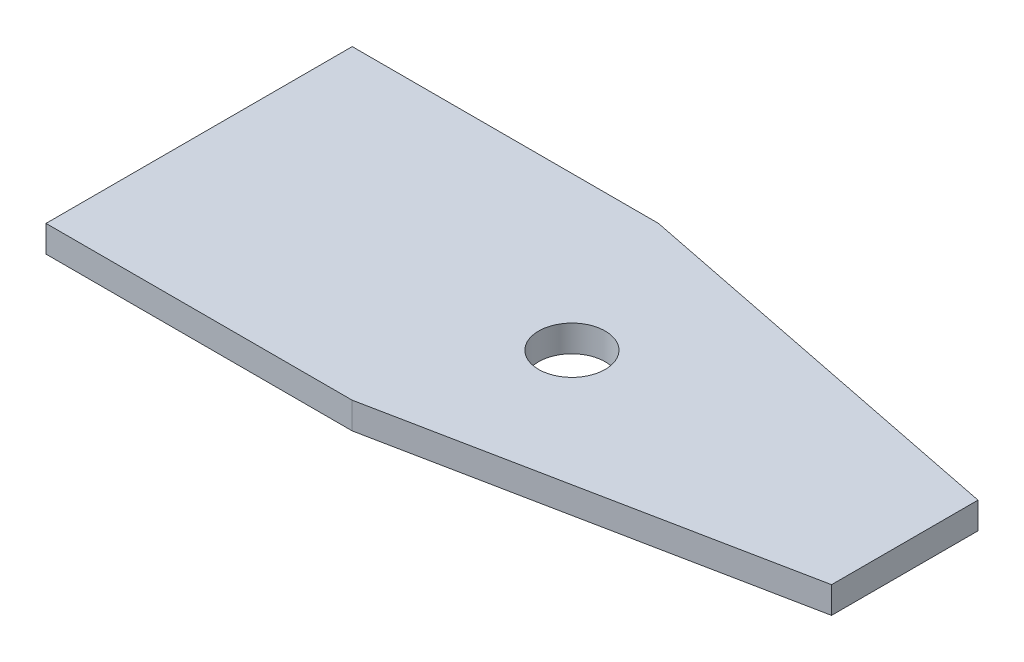
ISO-10303-21;
HEADER;
FILE_DESCRIPTION(('STEP AP214'),'2;1');
FILE_NAME('part.step','',(''),(''),'','','');
FILE_SCHEMA(('AUTOMOTIVE_DESIGN { 1 0 10303 214 1 1 1 1 }'));
ENDSEC;
DATA;
#1=APPLICATION_CONTEXT('core data for automotive mechanical design processes');
#2=APPLICATION_PROTOCOL_DEFINITION('international standard','automotive_design',2000,#1);
#3=PRODUCT_CONTEXT('',#1,'mechanical');
#4=PRODUCT('Part','Part','',(#3));
#5=PRODUCT_RELATED_PRODUCT_CATEGORY('part','',(#4));
#6=PRODUCT_DEFINITION_FORMATION('','',#4);
#7=PRODUCT_DEFINITION_CONTEXT('part definition',#1,'design');
#8=PRODUCT_DEFINITION('design','',#6,#7);
#9=PRODUCT_DEFINITION_SHAPE('','',#8);
#10=(LENGTH_UNIT() NAMED_UNIT(*) SI_UNIT(.MILLI.,.METRE.));
#11=(NAMED_UNIT(*) PLANE_ANGLE_UNIT() SI_UNIT($,.RADIAN.));
#12=(NAMED_UNIT(*) SI_UNIT($,.STERADIAN.) SOLID_ANGLE_UNIT());
#13=UNCERTAINTY_MEASURE_WITH_UNIT(LENGTH_MEASURE(1.E-05),#10,'distance_accuracy_value','');
#14=(GEOMETRIC_REPRESENTATION_CONTEXT(3) GLOBAL_UNCERTAINTY_ASSIGNED_CONTEXT((#13)) GLOBAL_UNIT_ASSIGNED_CONTEXT((#10,
#11,#12)) REPRESENTATION_CONTEXT('',''));
#15=CARTESIAN_POINT('',(0.,0.,0.));
#16=DIRECTION('',(0.,0.,1.));
#17=DIRECTION('',(1.,0.,0.));
#18=AXIS2_PLACEMENT_3D('',#15,#16,#17);
#19=CARTESIAN_POINT('',(0.,2.,0.));
#20=DIRECTION('',(0.,-1.,0.));
#21=DIRECTION('',(0.,0.,-1.));
#22=AXIS2_PLACEMENT_3D('',#19,#20,#21);
#23=PLANE('',#22);
#24=DIRECTION('',(0.,0.,-1.));
#25=VECTOR('',#24,1.);
#26=CARTESIAN_POINT('',(53.,2.,0.));
#27=LINE('',#26,#25);
#28=CARTESIAN_POINT('',(53.,2.,-5.99999999999998));
#29=VERTEX_POINT('',#28);
#30=CARTESIAN_POINT('',(53.,2.,-17.));
#31=VERTEX_POINT('',#30);
#32=EDGE_CURVE('E124',#29,#31,#27,.T.);
#33=ORIENTED_EDGE('',*,*,#32,.T.);
#34=DIRECTION('',(0.98058067569092,0.,0.196116135138185));
#35=VECTOR('',#34,1.);
#36=CARTESIAN_POINT('',(53.,2.,-17.));
#37=LINE('',#36,#35);
#38=CARTESIAN_POINT('',(23.,2.,-23.));
#39=VERTEX_POINT('',#38);
#40=EDGE_CURVE('E91',#39,#31,#37,.T.);
#41=ORIENTED_EDGE('',*,*,#40,.F.);
#42=DIRECTION('',(-1.,0.,0.));
#43=VECTOR('',#42,1.);
#44=CARTESIAN_POINT('',(0.,2.,-23.));
#45=LINE('',#44,#43);
#46=CARTESIAN_POINT('',(0.,2.,-23.));
#47=VERTEX_POINT('',#46);
#48=EDGE_CURVE('E119',#39,#47,#45,.T.);
#49=ORIENTED_EDGE('',*,*,#48,.T.);
#50=DIRECTION('',(0.,0.,1.));
#51=VECTOR('',#50,1.);
#52=CARTESIAN_POINT('',(0.,2.,0.));
#53=LINE('',#52,#51);
#54=CARTESIAN_POINT('',(0.,2.,0.));
#55=VERTEX_POINT('',#54);
#56=EDGE_CURVE('E112',#47,#55,#53,.T.);
#57=ORIENTED_EDGE('',*,*,#56,.T.);
#58=DIRECTION('',(1.,0.,0.));
#59=VECTOR('',#58,1.);
#60=CARTESIAN_POINT('',(0.,2.,0.));
#61=LINE('',#60,#59);
#62=CARTESIAN_POINT('',(23.,2.,0.));
#63=VERTEX_POINT('',#62);
#64=EDGE_CURVE('E129',#55,#63,#61,.T.);
#65=ORIENTED_EDGE('',*,*,#64,.T.);
#66=DIRECTION('',(-0.98058067569092,0.,0.196116135138183));
#67=VECTOR('',#66,1.);
#68=CARTESIAN_POINT('',(23.,2.,0.));
#69=LINE('',#68,#67);
#70=EDGE_CURVE('E146',#29,#63,#69,.T.);
#71=ORIENTED_EDGE('',*,*,#70,.F.);
#72=EDGE_LOOP('',(#33,#41,#49,#57,#65,#71));
#73=FACE_BOUND('',#72,.T.);
#74=CARTESIAN_POINT('',(28.,2.,-11.5));
#75=DIRECTION('',(0.,1.,0.));
#76=DIRECTION('',(0.,0.,1.));
#77=AXIS2_PLACEMENT_3D('',#74,#75,#76);
#78=CIRCLE('',#77,2.5);
#79=CARTESIAN_POINT('',(28.,2.,-9.));
#80=VERTEX_POINT('',#79);
#81=EDGE_CURVE('E132',#80,#80,#78,.T.);
#82=ORIENTED_EDGE('',*,*,#81,.F.);
#83=EDGE_LOOP('',(#82));
#84=FACE_BOUND('',#83,.T.);
#85=ADVANCED_FACE('F37',(#73,#84),#23,.F.);
#86=CARTESIAN_POINT('',(0.,0.,0.));
#87=DIRECTION('',(0.,-1.,0.));
#88=DIRECTION('',(0.,0.,-1.));
#89=AXIS2_PLACEMENT_3D('',#86,#87,#88);
#90=PLANE('',#89);
#91=DIRECTION('',(0.98058067569092,0.,0.196116135138185));
#92=VECTOR('',#91,1.);
#93=CARTESIAN_POINT('',(53.,0.,-17.));
#94=LINE('',#93,#92);
#95=CARTESIAN_POINT('',(23.,0.,-23.));
#96=VERTEX_POINT('',#95);
#97=CARTESIAN_POINT('',(53.,0.,-17.));
#98=VERTEX_POINT('',#97);
#99=EDGE_CURVE('E60',#96,#98,#94,.T.);
#100=ORIENTED_EDGE('',*,*,#99,.T.);
#101=DIRECTION('',(0.,0.,-1.));
#102=VECTOR('',#101,1.);
#103=CARTESIAN_POINT('',(53.,0.,0.));
#104=LINE('',#103,#102);
#105=CARTESIAN_POINT('',(53.,0.,-5.99999999999998));
#106=VERTEX_POINT('',#105);
#107=EDGE_CURVE('E104',#106,#98,#104,.T.);
#108=ORIENTED_EDGE('',*,*,#107,.F.);
#109=DIRECTION('',(-0.98058067569092,0.,0.196116135138183));
#110=VECTOR('',#109,1.);
#111=CARTESIAN_POINT('',(23.,0.,0.));
#112=LINE('',#111,#110);
#113=CARTESIAN_POINT('',(23.,0.,0.));
#114=VERTEX_POINT('',#113);
#115=EDGE_CURVE('E52',#106,#114,#112,.T.);
#116=ORIENTED_EDGE('',*,*,#115,.T.);
#117=DIRECTION('',(1.,0.,0.));
#118=VECTOR('',#117,1.);
#119=CARTESIAN_POINT('',(0.,0.,0.));
#120=LINE('',#119,#118);
#121=CARTESIAN_POINT('',(0.,0.,0.));
#122=VERTEX_POINT('',#121);
#123=EDGE_CURVE('E110',#122,#114,#120,.T.);
#124=ORIENTED_EDGE('',*,*,#123,.F.);
#125=DIRECTION('',(0.,0.,1.));
#126=VECTOR('',#125,1.);
#127=CARTESIAN_POINT('',(0.,0.,0.));
#128=LINE('',#127,#126);
#129=CARTESIAN_POINT('',(0.,0.,-23.));
#130=VERTEX_POINT('',#129);
#131=EDGE_CURVE('E115',#130,#122,#128,.T.);
#132=ORIENTED_EDGE('',*,*,#131,.F.);
#133=DIRECTION('',(-1.,0.,0.));
#134=VECTOR('',#133,1.);
#135=CARTESIAN_POINT('',(0.,0.,-23.));
#136=LINE('',#135,#134);
#137=EDGE_CURVE('E106',#96,#130,#136,.T.);
#138=ORIENTED_EDGE('',*,*,#137,.F.);
#139=EDGE_LOOP('',(#100,#108,#116,#124,#132,#138));
#140=FACE_BOUND('',#139,.T.);
#141=CARTESIAN_POINT('',(28.,0.,-11.5));
#142=DIRECTION('',(0.,1.,0.));
#143=DIRECTION('',(0.,0.,1.));
#144=AXIS2_PLACEMENT_3D('',#141,#142,#143);
#145=CIRCLE('',#144,2.5);
#146=CARTESIAN_POINT('',(28.,0.,-9.));
#147=VERTEX_POINT('',#146);
#148=EDGE_CURVE('E96',#147,#147,#145,.T.);
#149=ORIENTED_EDGE('',*,*,#148,.T.);
#150=EDGE_LOOP('',(#149));
#151=FACE_BOUND('',#150,.T.);
#152=ADVANCED_FACE('F102',(#140,#151),#90,.T.);
#153=CARTESIAN_POINT('',(0.,2.,0.));
#154=DIRECTION('',(1.,0.,0.));
#155=DIRECTION('',(0.,0.,-1.));
#156=AXIS2_PLACEMENT_3D('',#153,#154,#155);
#157=PLANE('',#156);
#158=ORIENTED_EDGE('',*,*,#131,.T.);
#159=DIRECTION('',(0.,-1.,0.));
#160=VECTOR('',#159,1.);
#161=CARTESIAN_POINT('',(0.,2.,0.));
#162=LINE('',#161,#160);
#163=EDGE_CURVE('E11',#55,#122,#162,.T.);
#164=ORIENTED_EDGE('',*,*,#163,.F.);
#165=ORIENTED_EDGE('',*,*,#56,.F.);
#166=DIRECTION('',(0.,-1.,0.));
#167=VECTOR('',#166,1.);
#168=CARTESIAN_POINT('',(0.,2.,-23.));
#169=LINE('',#168,#167);
#170=EDGE_CURVE('E45',#47,#130,#169,.T.);
#171=ORIENTED_EDGE('',*,*,#170,.T.);
#172=EDGE_LOOP('',(#158,#164,#165,#171));
#173=FACE_BOUND('',#172,.T.);
#174=ADVANCED_FACE('F39',(#173),#157,.F.);
#175=CARTESIAN_POINT('',(0.,2.,0.));
#176=DIRECTION('',(0.,0.,-1.));
#177=DIRECTION('',(-1.,0.,0.));
#178=AXIS2_PLACEMENT_3D('',#175,#176,#177);
#179=PLANE('',#178);
#180=ORIENTED_EDGE('',*,*,#123,.T.);
#181=DIRECTION('',(0.,1.,0.));
#182=VECTOR('',#181,1.);
#183=CARTESIAN_POINT('',(23.,0.,0.));
#184=LINE('',#183,#182);
#185=EDGE_CURVE('E150',#114,#63,#184,.T.);
#186=ORIENTED_EDGE('',*,*,#185,.T.);
#187=ORIENTED_EDGE('',*,*,#64,.F.);
#188=ORIENTED_EDGE('',*,*,#163,.T.);
#189=EDGE_LOOP('',(#180,#186,#187,#188));
#190=FACE_BOUND('',#189,.T.);
#191=ADVANCED_FACE('F149',(#190),#179,.F.);
#192=CARTESIAN_POINT('',(53.,2.,0.));
#193=DIRECTION('',(-1.,0.,0.));
#194=DIRECTION('',(0.,0.,1.));
#195=AXIS2_PLACEMENT_3D('',#192,#193,#194);
#196=PLANE('',#195);
#197=ORIENTED_EDGE('',*,*,#107,.T.);
#198=DIRECTION('',(0.,1.,0.));
#199=VECTOR('',#198,1.);
#200=CARTESIAN_POINT('',(53.,0.,-17.));
#201=LINE('',#200,#199);
#202=EDGE_CURVE('E88',#98,#31,#201,.T.);
#203=ORIENTED_EDGE('',*,*,#202,.T.);
#204=ORIENTED_EDGE('',*,*,#32,.F.);
#205=DIRECTION('',(0.,1.,0.));
#206=VECTOR('',#205,1.);
#207=CARTESIAN_POINT('',(53.,0.,-5.99999999999998));
#208=LINE('',#207,#206);
#209=EDGE_CURVE('E109',#106,#29,#208,.T.);
#210=ORIENTED_EDGE('',*,*,#209,.F.);
#211=EDGE_LOOP('',(#197,#203,#204,#210));
#212=FACE_BOUND('',#211,.T.);
#213=ADVANCED_FACE('F108',(#212),#196,.F.);
#214=CARTESIAN_POINT('',(0.,2.,-23.));
#215=DIRECTION('',(0.,0.,1.));
#216=DIRECTION('',(1.,0.,0.));
#217=AXIS2_PLACEMENT_3D('',#214,#215,#216);
#218=PLANE('',#217);
#219=ORIENTED_EDGE('',*,*,#48,.F.);
#220=DIRECTION('',(0.,1.,0.));
#221=VECTOR('',#220,1.);
#222=CARTESIAN_POINT('',(23.,0.,-23.));
#223=LINE('',#222,#221);
#224=EDGE_CURVE('E97',#96,#39,#223,.T.);
#225=ORIENTED_EDGE('',*,*,#224,.F.);
#226=ORIENTED_EDGE('',*,*,#137,.T.);
#227=ORIENTED_EDGE('',*,*,#170,.F.);
#228=EDGE_LOOP('',(#219,#225,#226,#227));
#229=FACE_BOUND('',#228,.T.);
#230=ADVANCED_FACE('F156',(#229),#218,.F.);
#231=CARTESIAN_POINT('',(28.,2.,-11.5));
#232=DIRECTION('',(0.,-1.,0.));
#233=DIRECTION('',(0.,0.,-1.));
#234=AXIS2_PLACEMENT_3D('',#231,#232,#233);
#235=CYLINDRICAL_SURFACE('',#234,2.5);
#236=ORIENTED_EDGE('',*,*,#81,.T.);
#237=EDGE_LOOP('',(#236));
#238=FACE_BOUND('',#237,.T.);
#239=ORIENTED_EDGE('',*,*,#148,.F.);
#240=EDGE_LOOP('',(#239));
#241=FACE_BOUND('',#240,.T.);
#242=ADVANCED_FACE('F168',(#238,#241),#235,.F.);
#243=CARTESIAN_POINT('',(53.,0.,-17.));
#244=DIRECTION('',(-0.196116135138185,0.,0.98058067569092));
#245=DIRECTION('',(0.98058067569092,0.,0.196116135138185));
#246=AXIS2_PLACEMENT_3D('',#243,#244,#245);
#247=PLANE('',#246);
#248=ORIENTED_EDGE('',*,*,#40,.T.);
#249=ORIENTED_EDGE('',*,*,#202,.F.);
#250=ORIENTED_EDGE('',*,*,#99,.F.);
#251=ORIENTED_EDGE('',*,*,#224,.T.);
#252=EDGE_LOOP('',(#248,#249,#250,#251));
#253=FACE_BOUND('',#252,.T.);
#254=ADVANCED_FACE('F89',(#253),#247,.F.);
#255=CARTESIAN_POINT('',(23.,0.,0.));
#256=DIRECTION('',(-0.196116135138183,0.,-0.98058067569092));
#257=DIRECTION('',(-0.98058067569092,0.,0.196116135138183));
#258=AXIS2_PLACEMENT_3D('',#255,#256,#257);
#259=PLANE('',#258);
#260=ORIENTED_EDGE('',*,*,#70,.T.);
#261=ORIENTED_EDGE('',*,*,#185,.F.);
#262=ORIENTED_EDGE('',*,*,#115,.F.);
#263=ORIENTED_EDGE('',*,*,#209,.T.);
#264=EDGE_LOOP('',(#260,#261,#262,#263));
#265=FACE_BOUND('',#264,.T.);
#266=ADVANCED_FACE('F193',(#265),#259,.F.);
#267=CLOSED_SHELL('',(#85,#152,#174,#191,#213,#230,#242,#254,#266));
#268=MANIFOLD_SOLID_BREP('B2',#267);
#269=ADVANCED_BREP_SHAPE_REPRESENTATION('',(#18,#268),#14);
#270=SHAPE_DEFINITION_REPRESENTATION(#9,#269);
ENDSEC;
END-ISO-10303-21;
